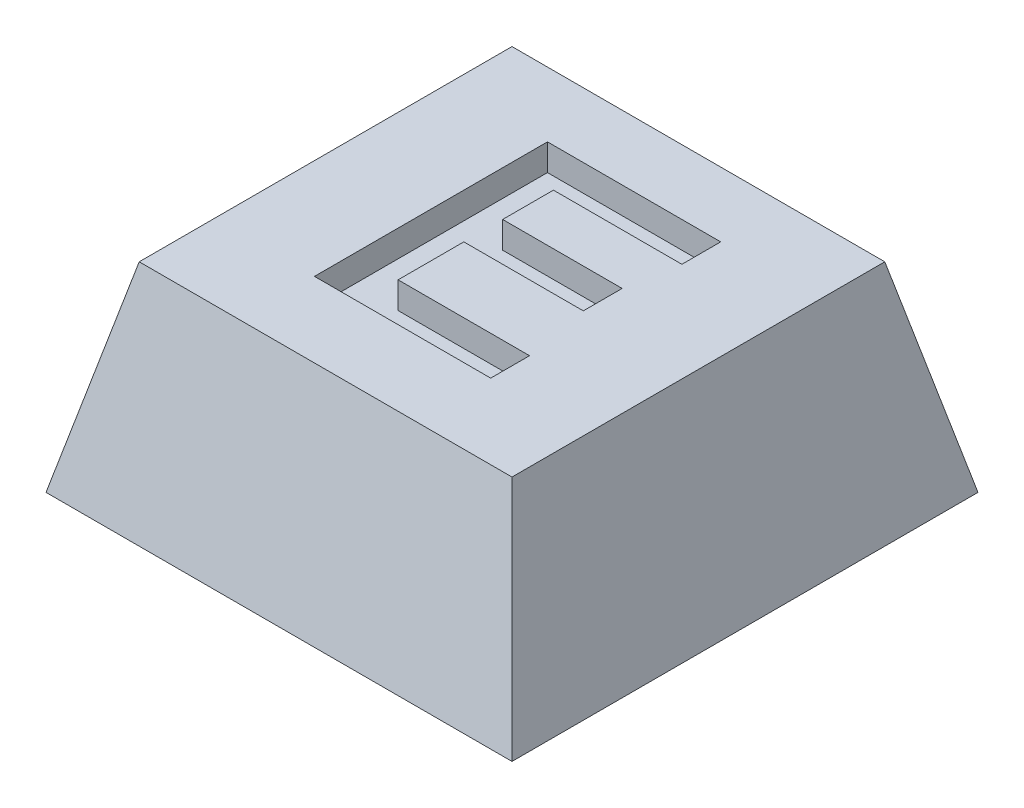
ISO-10303-21;
HEADER;
FILE_DESCRIPTION(('STEP AP214'),'2;1');
FILE_NAME('part.step','',(''),(''),'','','');
FILE_SCHEMA(('AUTOMOTIVE_DESIGN { 1 0 10303 214 1 1 1 1 }'));
ENDSEC;
DATA;
#1=APPLICATION_CONTEXT('core data for automotive mechanical design processes');
#2=APPLICATION_PROTOCOL_DEFINITION('international standard','automotive_design',2000,#1);
#3=PRODUCT_CONTEXT('',#1,'mechanical');
#4=PRODUCT('Part','Part','',(#3));
#5=PRODUCT_RELATED_PRODUCT_CATEGORY('part','',(#4));
#6=PRODUCT_DEFINITION_FORMATION('','',#4);
#7=PRODUCT_DEFINITION_CONTEXT('part definition',#1,'design');
#8=PRODUCT_DEFINITION('design','',#6,#7);
#9=PRODUCT_DEFINITION_SHAPE('','',#8);
#10=(LENGTH_UNIT() NAMED_UNIT(*) SI_UNIT(.MILLI.,.METRE.));
#11=(NAMED_UNIT(*) PLANE_ANGLE_UNIT() SI_UNIT($,.RADIAN.));
#12=(NAMED_UNIT(*) SI_UNIT($,.STERADIAN.) SOLID_ANGLE_UNIT());
#13=UNCERTAINTY_MEASURE_WITH_UNIT(LENGTH_MEASURE(1.E-05),#10,'distance_accuracy_value','');
#14=(GEOMETRIC_REPRESENTATION_CONTEXT(3) GLOBAL_UNCERTAINTY_ASSIGNED_CONTEXT((#13)) GLOBAL_UNIT_ASSIGNED_CONTEXT((#10,
#11,#12)) REPRESENTATION_CONTEXT('',''));
#15=CARTESIAN_POINT('',(0.,0.,0.));
#16=DIRECTION('',(0.,0.,1.));
#17=DIRECTION('',(1.,0.,0.));
#18=AXIS2_PLACEMENT_3D('',#15,#16,#17);
#19=CARTESIAN_POINT('',(0.,3.,0.));
#20=DIRECTION('',(0.,-1.,0.));
#21=DIRECTION('',(0.,0.,-1.));
#22=AXIS2_PLACEMENT_3D('',#19,#20,#21);
#23=PLANE('',#22);
#24=DIRECTION('',(-1.,0.,0.));
#25=VECTOR('',#24,1.);
#26=CARTESIAN_POINT('',(11.,3.,-0.7));
#27=LINE('',#26,#25);
#28=CARTESIAN_POINT('',(6.3,3.,-0.7));
#29=VERTEX_POINT('',#28);
#30=CARTESIAN_POINT('',(0.7,3.,-0.7));
#31=VERTEX_POINT('',#30);
#32=EDGE_CURVE('E66',#29,#31,#27,.T.);
#33=ORIENTED_EDGE('',*,*,#32,.F.);
#34=DIRECTION('',(0.,0.,1.));
#35=VECTOR('',#34,1.);
#36=CARTESIAN_POINT('',(6.3,3.,-7.));
#37=LINE('',#36,#35);
#38=CARTESIAN_POINT('',(6.3,3.,-6.3));
#39=VERTEX_POINT('',#38);
#40=EDGE_CURVE('E207',#39,#29,#37,.T.);
#41=ORIENTED_EDGE('',*,*,#40,.F.);
#42=DIRECTION('',(-1.,0.,0.));
#43=VECTOR('',#42,1.);
#44=CARTESIAN_POINT('',(11.,3.,-6.3));
#45=LINE('',#44,#43);
#46=CARTESIAN_POINT('',(0.699999999999998,3.,-6.3));
#47=VERTEX_POINT('',#46);
#48=EDGE_CURVE('E194',#39,#47,#45,.T.);
#49=ORIENTED_EDGE('',*,*,#48,.T.);
#50=DIRECTION('',(0.,0.,1.));
#51=VECTOR('',#50,1.);
#52=CARTESIAN_POINT('',(0.7,3.,-7.));
#53=LINE('',#52,#51);
#54=EDGE_CURVE('E208',#47,#31,#53,.T.);
#55=ORIENTED_EDGE('',*,*,#54,.T.);
#56=EDGE_LOOP('',(#33,#41,#49,#55));
#57=FACE_BOUND('',#56,.T.);
#58=DIRECTION('',(-1.,0.,0.));
#59=VECTOR('',#58,1.);
#60=CARTESIAN_POINT('',(4.85340318715444,3.,-1.82675202785535));
#61=LINE('',#60,#59);
#62=CARTESIAN_POINT('',(4.85340318715444,3.,-1.82675202785535));
#63=VERTEX_POINT('',#62);
#64=CARTESIAN_POINT('',(2.20596728971854,3.,-1.82675202785535));
#65=VERTEX_POINT('',#64);
#66=EDGE_CURVE('E59',#63,#65,#61,.T.);
#67=ORIENTED_EDGE('',*,*,#66,.T.);
#68=DIRECTION('',(0.,0.,-1.));
#69=VECTOR('',#68,1.);
#70=CARTESIAN_POINT('',(2.20596728971854,3.,-1.82675202785535));
#71=LINE('',#70,#69);
#72=CARTESIAN_POINT('',(2.20596728971854,3.,-5.32675202785535));
#73=VERTEX_POINT('',#72);
#74=EDGE_CURVE('E178',#65,#73,#71,.T.);
#75=ORIENTED_EDGE('',*,*,#74,.T.);
#76=DIRECTION('',(1.,0.,0.));
#77=VECTOR('',#76,1.);
#78=CARTESIAN_POINT('',(2.20596728971854,3.,-5.32675202785535));
#79=LINE('',#78,#77);
#80=CARTESIAN_POINT('',(4.80853139228265,3.,-5.32675202785535));
#81=VERTEX_POINT('',#80);
#82=EDGE_CURVE('E533',#73,#81,#79,.T.);
#83=ORIENTED_EDGE('',*,*,#82,.T.);
#84=DIRECTION('',(0.,0.,1.));
#85=VECTOR('',#84,1.);
#86=CARTESIAN_POINT('',(4.80853139228265,3.,-5.32675202785535));
#87=LINE('',#86,#85);
#88=CARTESIAN_POINT('',(4.80853139228265,3.,-4.74341869452202));
#89=VERTEX_POINT('',#88);
#90=EDGE_CURVE('E535',#81,#89,#87,.T.);
#91=ORIENTED_EDGE('',*,*,#90,.T.);
#92=DIRECTION('',(-1.,0.,0.));
#93=VECTOR('',#92,1.);
#94=CARTESIAN_POINT('',(4.80853139228265,3.,-4.74341869452202));
#95=LINE('',#94,#93);
#96=CARTESIAN_POINT('',(2.87904421279547,3.,-4.74341869452202));
#97=VERTEX_POINT('',#96);
#98=EDGE_CURVE('E540',#89,#97,#95,.T.);
#99=ORIENTED_EDGE('',*,*,#98,.T.);
#100=DIRECTION('',(0.,0.,1.));
#101=VECTOR('',#100,1.);
#102=CARTESIAN_POINT('',(2.87904421279547,3.,-4.74341869452202));
#103=LINE('',#102,#101);
#104=CARTESIAN_POINT('',(2.87904421279547,3.,-3.9805981817015));
#105=VERTEX_POINT('',#104);
#106=EDGE_CURVE('E550',#97,#105,#103,.T.);
#107=ORIENTED_EDGE('',*,*,#106,.T.);
#108=DIRECTION('',(1.,0.,0.));
#109=VECTOR('',#108,1.);
#110=CARTESIAN_POINT('',(2.87904421279547,3.,-3.9805981817015));
#111=LINE('',#110,#109);
#112=CARTESIAN_POINT('',(4.67391600766726,3.,-3.9805981817015));
#113=VERTEX_POINT('',#112);
#114=EDGE_CURVE('E554',#105,#113,#111,.T.);
#115=ORIENTED_EDGE('',*,*,#114,.T.);
#116=DIRECTION('',(0.,0.,1.));
#117=VECTOR('',#116,1.);
#118=CARTESIAN_POINT('',(4.67391600766726,3.,-3.9805981817015));
#119=LINE('',#118,#117);
#120=CARTESIAN_POINT('',(4.67391600766726,3.,-3.39726484836817));
#121=VERTEX_POINT('',#120);
#122=EDGE_CURVE('E558',#113,#121,#119,.T.);
#123=ORIENTED_EDGE('',*,*,#122,.T.);
#124=DIRECTION('',(-1.,0.,0.));
#125=VECTOR('',#124,1.);
#126=CARTESIAN_POINT('',(4.67391600766726,3.,-3.39726484836817));
#127=LINE('',#126,#125);
#128=CARTESIAN_POINT('',(2.87904421279547,3.,-3.39726484836817));
#129=VERTEX_POINT('',#128);
#130=EDGE_CURVE('E499',#121,#129,#127,.T.);
#131=ORIENTED_EDGE('',*,*,#130,.T.);
#132=DIRECTION('',(0.,0.,1.));
#133=VECTOR('',#132,1.);
#134=CARTESIAN_POINT('',(2.87904421279547,3.,-3.39726484836817));
#135=LINE('',#134,#133);
#136=CARTESIAN_POINT('',(2.87904421279547,3.,-2.41008536118868));
#137=VERTEX_POINT('',#136);
#138=EDGE_CURVE('E494',#129,#137,#135,.T.);
#139=ORIENTED_EDGE('',*,*,#138,.T.);
#140=DIRECTION('',(1.,0.,0.));
#141=VECTOR('',#140,1.);
#142=CARTESIAN_POINT('',(2.87904421279547,3.,-2.41008536118868));
#143=LINE('',#142,#141);
#144=CARTESIAN_POINT('',(4.85340318715444,3.,-2.41008536118868));
#145=VERTEX_POINT('',#144);
#146=EDGE_CURVE('E488',#137,#145,#143,.T.);
#147=ORIENTED_EDGE('',*,*,#146,.T.);
#148=DIRECTION('',(0.,0.,1.));
#149=VECTOR('',#148,1.);
#150=CARTESIAN_POINT('',(4.85340318715444,3.,-2.41008536118868));
#151=LINE('',#150,#149);
#152=EDGE_CURVE('E174',#145,#63,#151,.T.);
#153=ORIENTED_EDGE('',*,*,#152,.T.);
#154=EDGE_LOOP('',(#67,#75,#83,#91,#99,#107,#115,#123,#131,#139,#147,#153));
#155=FACE_BOUND('',#154,.T.);
#156=ADVANCED_FACE('F43',(#57,#155),#23,.F.);
#157=CARTESIAN_POINT('',(7.,0.,-7.));
#158=DIRECTION('',(-0.973841209741793,-0.227229615606418,0.));
#159=DIRECTION('',(0.227229615606418,-0.973841209741793,0.));
#160=AXIS2_PLACEMENT_3D('',#157,#158,#159);
#161=PLANE('',#160);
#162=DIRECTION('',(-0.221581128241521,0.949633406749377,-0.221581128241521));
#163=VECTOR('',#162,1.);
#164=CARTESIAN_POINT('',(6.6563126252505,1.47294589178357,-0.343687374749499));
#165=LINE('',#164,#163);
#166=CARTESIAN_POINT('',(7.,0.,0.));
#167=VERTEX_POINT('',#166);
#168=EDGE_CURVE('E204',#167,#29,#165,.T.);
#169=ORIENTED_EDGE('',*,*,#168,.F.);
#170=DIRECTION('',(0.,0.,-1.));
#171=VECTOR('',#170,1.);
#172=CARTESIAN_POINT('',(7.,0.,0.));
#173=LINE('',#172,#171);
#174=CARTESIAN_POINT('',(7.,0.,-7.));
#175=VERTEX_POINT('',#174);
#176=EDGE_CURVE('E222',#167,#175,#173,.T.);
#177=ORIENTED_EDGE('',*,*,#176,.T.);
#178=DIRECTION('',(0.221581128241521,-0.949633406749377,-0.221581128241521));
#179=VECTOR('',#178,1.);
#180=CARTESIAN_POINT('',(7.,0.,-7.));
#181=LINE('',#180,#179);
#182=EDGE_CURVE('E198',#39,#175,#181,.T.);
#183=ORIENTED_EDGE('',*,*,#182,.F.);
#184=ORIENTED_EDGE('',*,*,#40,.T.);
#185=EDGE_LOOP('',(#169,#177,#183,#184));
#186=FACE_BOUND('',#185,.T.);
#187=ADVANCED_FACE('F247',(#186),#161,.F.);
#188=CARTESIAN_POINT('',(0.,0.,-7.));
#189=DIRECTION('',(0.973841209741793,-0.227229615606418,0.));
#190=DIRECTION('',(0.227229615606418,0.973841209741793,0.));
#191=AXIS2_PLACEMENT_3D('',#188,#189,#190);
#192=PLANE('',#191);
#193=DIRECTION('',(-0.221581128241521,-0.949633406749378,0.221581128241521));
#194=VECTOR('',#193,1.);
#195=CARTESIAN_POINT('',(0.343687374749499,1.47294589178357,-0.3436873747495));
#196=LINE('',#195,#194);
#197=CARTESIAN_POINT('',(0.,0.,0.));
#198=VERTEX_POINT('',#197);
#199=EDGE_CURVE('E11',#31,#198,#196,.T.);
#200=ORIENTED_EDGE('',*,*,#199,.F.);
#201=ORIENTED_EDGE('',*,*,#54,.F.);
#202=DIRECTION('',(0.221581128241521,0.949633406749377,0.221581128241521));
#203=VECTOR('',#202,1.);
#204=CARTESIAN_POINT('',(0.,0.,-7.));
#205=LINE('',#204,#203);
#206=CARTESIAN_POINT('',(0.,0.,-7.));
#207=VERTEX_POINT('',#206);
#208=EDGE_CURVE('E52',#207,#47,#205,.T.);
#209=ORIENTED_EDGE('',*,*,#208,.F.);
#210=DIRECTION('',(0.,0.,1.));
#211=VECTOR('',#210,1.);
#212=CARTESIAN_POINT('',(0.,0.,0.));
#213=LINE('',#212,#211);
#214=EDGE_CURVE('E212',#207,#198,#213,.T.);
#215=ORIENTED_EDGE('',*,*,#214,.T.);
#216=EDGE_LOOP('',(#200,#201,#209,#215));
#217=FACE_BOUND('',#216,.T.);
#218=ADVANCED_FACE('F240',(#217),#192,.F.);
#219=CARTESIAN_POINT('',(0.,0.,0.));
#220=DIRECTION('',(0.,-1.,0.));
#221=DIRECTION('',(0.,0.,-1.));
#222=AXIS2_PLACEMENT_3D('',#219,#220,#221);
#223=PLANE('',#222);
#224=CARTESIAN_POINT('',(3.5,0.,-3.5));
#225=DIRECTION('',(0.,-1.,0.));
#226=DIRECTION('',(0.,0.,-1.));
#227=AXIS2_PLACEMENT_3D('',#224,#225,#226);
#228=CIRCLE('',#227,1.8);
#229=CARTESIAN_POINT('',(3.5,0.,-5.3));
#230=VERTEX_POINT('',#229);
#231=EDGE_CURVE('E180',#230,#230,#228,.T.);
#232=ORIENTED_EDGE('',*,*,#231,.F.);
#233=EDGE_LOOP('',(#232));
#234=FACE_BOUND('',#233,.T.);
#235=ORIENTED_EDGE('',*,*,#214,.F.);
#236=DIRECTION('',(-1.,0.,0.));
#237=VECTOR('',#236,1.);
#238=CARTESIAN_POINT('',(0.,0.,-7.));
#239=LINE('',#238,#237);
#240=EDGE_CURVE('E226',#175,#207,#239,.T.);
#241=ORIENTED_EDGE('',*,*,#240,.F.);
#242=ORIENTED_EDGE('',*,*,#176,.F.);
#243=DIRECTION('',(1.,0.,0.));
#244=VECTOR('',#243,1.);
#245=CARTESIAN_POINT('',(0.,0.,0.));
#246=LINE('',#245,#244);
#247=EDGE_CURVE('E219',#198,#167,#246,.T.);
#248=ORIENTED_EDGE('',*,*,#247,.F.);
#249=EDGE_LOOP('',(#235,#241,#242,#248));
#250=FACE_BOUND('',#249,.T.);
#251=ADVANCED_FACE('F45',(#234,#250),#223,.T.);
#252=CARTESIAN_POINT('',(11.,3.,-6.3));
#253=DIRECTION('',(0.,0.227229615606418,-0.973841209741793));
#254=DIRECTION('',(0.,0.973841209741793,0.227229615606418));
#255=AXIS2_PLACEMENT_3D('',#252,#253,#254);
#256=PLANE('',#255);
#257=ORIENTED_EDGE('',*,*,#182,.T.);
#258=ORIENTED_EDGE('',*,*,#240,.T.);
#259=ORIENTED_EDGE('',*,*,#208,.T.);
#260=ORIENTED_EDGE('',*,*,#48,.F.);
#261=EDGE_LOOP('',(#257,#258,#259,#260));
#262=FACE_BOUND('',#261,.T.);
#263=ADVANCED_FACE('F231',(#262),#256,.T.);
#264=CARTESIAN_POINT('',(11.,0.,0.));
#265=DIRECTION('',(0.,0.227229615606418,0.973841209741793));
#266=DIRECTION('',(0.,-0.973841209741793,0.227229615606418));
#267=AXIS2_PLACEMENT_3D('',#264,#265,#266);
#268=PLANE('',#267);
#269=ORIENTED_EDGE('',*,*,#168,.T.);
#270=ORIENTED_EDGE('',*,*,#32,.T.);
#271=ORIENTED_EDGE('',*,*,#199,.T.);
#272=ORIENTED_EDGE('',*,*,#247,.T.);
#273=EDGE_LOOP('',(#269,#270,#271,#272));
#274=FACE_BOUND('',#273,.T.);
#275=ADVANCED_FACE('F242',(#274),#268,.T.);
#276=CARTESIAN_POINT('',(3.5,0.8,-3.5));
#277=DIRECTION('',(0.,-1.,0.));
#278=DIRECTION('',(0.,0.,-1.));
#279=AXIS2_PLACEMENT_3D('',#276,#277,#278);
#280=CYLINDRICAL_SURFACE('',#279,1.8);
#281=CARTESIAN_POINT('',(3.5,0.8,-3.5));
#282=DIRECTION('',(0.,-1.,0.));
#283=DIRECTION('',(0.,0.,-1.));
#284=AXIS2_PLACEMENT_3D('',#281,#282,#283);
#285=CIRCLE('',#284,1.8);
#286=CARTESIAN_POINT('',(3.5,0.8,-5.3));
#287=VERTEX_POINT('',#286);
#288=EDGE_CURVE('E186',#287,#287,#285,.T.);
#289=ORIENTED_EDGE('',*,*,#288,.F.);
#290=EDGE_LOOP('',(#289));
#291=FACE_BOUND('',#290,.T.);
#292=ORIENTED_EDGE('',*,*,#231,.T.);
#293=EDGE_LOOP('',(#292));
#294=FACE_BOUND('',#293,.T.);
#295=ADVANCED_FACE('F265',(#291,#294),#280,.F.);
#296=CARTESIAN_POINT('',(3.5,0.8,-3.5));
#297=DIRECTION('',(0.,-1.,0.));
#298=DIRECTION('',(0.,0.,-1.));
#299=AXIS2_PLACEMENT_3D('',#296,#297,#298);
#300=PLANE('',#299);
#301=ORIENTED_EDGE('',*,*,#288,.T.);
#302=EDGE_LOOP('',(#301));
#303=FACE_BOUND('',#302,.T.);
#304=ADVANCED_FACE('F268',(#303),#300,.T.);
#305=CARTESIAN_POINT('',(4.85340318715444,2.6,-1.82675202785535));
#306=DIRECTION('',(0.,0.,-1.));
#307=DIRECTION('',(-1.,0.,0.));
#308=AXIS2_PLACEMENT_3D('',#305,#306,#307);
#309=PLANE('',#308);
#310=ORIENTED_EDGE('',*,*,#66,.F.);
#311=DIRECTION('',(0.,1.,0.));
#312=VECTOR('',#311,1.);
#313=CARTESIAN_POINT('',(4.85340318715444,2.6,-1.82675202785535));
#314=LINE('',#313,#312);
#315=CARTESIAN_POINT('',(4.85340318715444,2.6,-1.82675202785535));
#316=VERTEX_POINT('',#315);
#317=EDGE_CURVE('E172',#316,#63,#314,.T.);
#318=ORIENTED_EDGE('',*,*,#317,.F.);
#319=DIRECTION('',(-1.,0.,0.));
#320=VECTOR('',#319,1.);
#321=CARTESIAN_POINT('',(4.85340318715444,2.6,-1.82675202785535));
#322=LINE('',#321,#320);
#323=CARTESIAN_POINT('',(2.20596728971854,2.6,-1.82675202785535));
#324=VERTEX_POINT('',#323);
#325=EDGE_CURVE('E162',#316,#324,#322,.T.);
#326=ORIENTED_EDGE('',*,*,#325,.T.);
#327=DIRECTION('',(0.,1.,0.));
#328=VECTOR('',#327,1.);
#329=CARTESIAN_POINT('',(2.20596728971854,2.6,-1.82675202785535));
#330=LINE('',#329,#328);
#331=EDGE_CURVE('E171',#324,#65,#330,.T.);
#332=ORIENTED_EDGE('',*,*,#331,.T.);
#333=EDGE_LOOP('',(#310,#318,#326,#332));
#334=FACE_BOUND('',#333,.T.);
#335=ADVANCED_FACE('F170',(#334),#309,.T.);
#336=CARTESIAN_POINT('',(2.20596728971854,2.6,-1.82675202785535));
#337=DIRECTION('',(1.,0.,0.));
#338=DIRECTION('',(0.,0.,-1.));
#339=AXIS2_PLACEMENT_3D('',#336,#337,#338);
#340=PLANE('',#339);
#341=ORIENTED_EDGE('',*,*,#74,.F.);
#342=ORIENTED_EDGE('',*,*,#331,.F.);
#343=DIRECTION('',(0.,0.,-1.));
#344=VECTOR('',#343,1.);
#345=CARTESIAN_POINT('',(2.20596728971854,2.6,-1.82675202785535));
#346=LINE('',#345,#344);
#347=CARTESIAN_POINT('',(2.20596728971854,2.6,-5.32675202785535));
#348=VERTEX_POINT('',#347);
#349=EDGE_CURVE('E158',#324,#348,#346,.T.);
#350=ORIENTED_EDGE('',*,*,#349,.T.);
#351=DIRECTION('',(0.,1.,0.));
#352=VECTOR('',#351,1.);
#353=CARTESIAN_POINT('',(2.20596728971854,2.6,-5.32675202785535));
#354=LINE('',#353,#352);
#355=EDGE_CURVE('E181',#348,#73,#354,.T.);
#356=ORIENTED_EDGE('',*,*,#355,.T.);
#357=EDGE_LOOP('',(#341,#342,#350,#356));
#358=FACE_BOUND('',#357,.T.);
#359=ADVANCED_FACE('F176',(#358),#340,.T.);
#360=CARTESIAN_POINT('',(2.20596728971854,2.6,-5.32675202785535));
#361=DIRECTION('',(0.,0.,1.));
#362=DIRECTION('',(1.,0.,0.));
#363=AXIS2_PLACEMENT_3D('',#360,#361,#362);
#364=PLANE('',#363);
#365=ORIENTED_EDGE('',*,*,#82,.F.);
#366=ORIENTED_EDGE('',*,*,#355,.F.);
#367=DIRECTION('',(1.,0.,0.));
#368=VECTOR('',#367,1.);
#369=CARTESIAN_POINT('',(2.20596728971854,2.6,-5.32675202785535));
#370=LINE('',#369,#368);
#371=CARTESIAN_POINT('',(4.80853139228265,2.6,-5.32675202785535));
#372=VERTEX_POINT('',#371);
#373=EDGE_CURVE('E164',#348,#372,#370,.T.);
#374=ORIENTED_EDGE('',*,*,#373,.T.);
#375=DIRECTION('',(0.,1.,0.));
#376=VECTOR('',#375,1.);
#377=CARTESIAN_POINT('',(4.80853139228265,2.6,-5.32675202785535));
#378=LINE('',#377,#376);
#379=EDGE_CURVE('E188',#372,#81,#378,.T.);
#380=ORIENTED_EDGE('',*,*,#379,.T.);
#381=EDGE_LOOP('',(#365,#366,#374,#380));
#382=FACE_BOUND('',#381,.T.);
#383=ADVANCED_FACE('F277',(#382),#364,.T.);
#384=CARTESIAN_POINT('',(4.80853139228265,2.6,-5.32675202785535));
#385=DIRECTION('',(-1.,0.,0.));
#386=DIRECTION('',(0.,0.,1.));
#387=AXIS2_PLACEMENT_3D('',#384,#385,#386);
#388=PLANE('',#387);
#389=ORIENTED_EDGE('',*,*,#90,.F.);
#390=ORIENTED_EDGE('',*,*,#379,.F.);
#391=DIRECTION('',(0.,0.,1.));
#392=VECTOR('',#391,1.);
#393=CARTESIAN_POINT('',(4.80853139228265,2.6,-5.32675202785535));
#394=LINE('',#393,#392);
#395=CARTESIAN_POINT('',(4.80853139228265,2.6,-4.74341869452202));
#396=VERTEX_POINT('',#395);
#397=EDGE_CURVE('E594',#372,#396,#394,.T.);
#398=ORIENTED_EDGE('',*,*,#397,.T.);
#399=DIRECTION('',(0.,1.,0.));
#400=VECTOR('',#399,1.);
#401=CARTESIAN_POINT('',(4.80853139228265,2.6,-4.74341869452202));
#402=LINE('',#401,#400);
#403=EDGE_CURVE('E526',#396,#89,#402,.T.);
#404=ORIENTED_EDGE('',*,*,#403,.T.);
#405=EDGE_LOOP('',(#389,#390,#398,#404));
#406=FACE_BOUND('',#405,.T.);
#407=ADVANCED_FACE('F280',(#406),#388,.T.);
#408=CARTESIAN_POINT('',(4.80853139228265,2.6,-4.74341869452202));
#409=DIRECTION('',(0.,0.,-1.));
#410=DIRECTION('',(-1.,0.,0.));
#411=AXIS2_PLACEMENT_3D('',#408,#409,#410);
#412=PLANE('',#411);
#413=ORIENTED_EDGE('',*,*,#98,.F.);
#414=ORIENTED_EDGE('',*,*,#403,.F.);
#415=DIRECTION('',(-1.,0.,0.));
#416=VECTOR('',#415,1.);
#417=CARTESIAN_POINT('',(4.80853139228265,2.6,-4.74341869452202));
#418=LINE('',#417,#416);
#419=CARTESIAN_POINT('',(2.87904421279547,2.6,-4.74341869452202));
#420=VERTEX_POINT('',#419);
#421=EDGE_CURVE('E591',#396,#420,#418,.T.);
#422=ORIENTED_EDGE('',*,*,#421,.T.);
#423=DIRECTION('',(0.,1.,0.));
#424=VECTOR('',#423,1.);
#425=CARTESIAN_POINT('',(2.87904421279547,2.6,-4.74341869452202));
#426=LINE('',#425,#424);
#427=EDGE_CURVE('E523',#420,#97,#426,.T.);
#428=ORIENTED_EDGE('',*,*,#427,.T.);
#429=EDGE_LOOP('',(#413,#414,#422,#428));
#430=FACE_BOUND('',#429,.T.);
#431=ADVANCED_FACE('F284',(#430),#412,.T.);
#432=CARTESIAN_POINT('',(2.87904421279547,2.6,-4.74341869452202));
#433=DIRECTION('',(-1.,0.,0.));
#434=DIRECTION('',(0.,0.,1.));
#435=AXIS2_PLACEMENT_3D('',#432,#433,#434);
#436=PLANE('',#435);
#437=ORIENTED_EDGE('',*,*,#106,.F.);
#438=ORIENTED_EDGE('',*,*,#427,.F.);
#439=DIRECTION('',(0.,0.,1.));
#440=VECTOR('',#439,1.);
#441=CARTESIAN_POINT('',(2.87904421279547,2.6,-4.74341869452202));
#442=LINE('',#441,#440);
#443=CARTESIAN_POINT('',(2.87904421279547,2.6,-3.9805981817015));
#444=VERTEX_POINT('',#443);
#445=EDGE_CURVE('E588',#420,#444,#442,.T.);
#446=ORIENTED_EDGE('',*,*,#445,.T.);
#447=DIRECTION('',(0.,1.,0.));
#448=VECTOR('',#447,1.);
#449=CARTESIAN_POINT('',(2.87904421279547,2.6,-3.9805981817015));
#450=LINE('',#449,#448);
#451=EDGE_CURVE('E520',#444,#105,#450,.T.);
#452=ORIENTED_EDGE('',*,*,#451,.T.);
#453=EDGE_LOOP('',(#437,#438,#446,#452));
#454=FACE_BOUND('',#453,.T.);
#455=ADVANCED_FACE('F288',(#454),#436,.T.);
#456=CARTESIAN_POINT('',(2.87904421279547,2.6,-3.9805981817015));
#457=DIRECTION('',(0.,0.,1.));
#458=DIRECTION('',(1.,0.,0.));
#459=AXIS2_PLACEMENT_3D('',#456,#457,#458);
#460=PLANE('',#459);
#461=ORIENTED_EDGE('',*,*,#114,.F.);
#462=ORIENTED_EDGE('',*,*,#451,.F.);
#463=DIRECTION('',(1.,0.,0.));
#464=VECTOR('',#463,1.);
#465=CARTESIAN_POINT('',(2.87904421279547,2.6,-3.9805981817015));
#466=LINE('',#465,#464);
#467=CARTESIAN_POINT('',(4.67391600766726,2.6,-3.9805981817015));
#468=VERTEX_POINT('',#467);
#469=EDGE_CURVE('E585',#444,#468,#466,.T.);
#470=ORIENTED_EDGE('',*,*,#469,.T.);
#471=DIRECTION('',(0.,1.,0.));
#472=VECTOR('',#471,1.);
#473=CARTESIAN_POINT('',(4.67391600766726,2.6,-3.9805981817015));
#474=LINE('',#473,#472);
#475=EDGE_CURVE('E517',#468,#113,#474,.T.);
#476=ORIENTED_EDGE('',*,*,#475,.T.);
#477=EDGE_LOOP('',(#461,#462,#470,#476));
#478=FACE_BOUND('',#477,.T.);
#479=ADVANCED_FACE('F292',(#478),#460,.T.);
#480=CARTESIAN_POINT('',(4.67391600766726,2.6,-3.9805981817015));
#481=DIRECTION('',(-1.,0.,0.));
#482=DIRECTION('',(0.,0.,1.));
#483=AXIS2_PLACEMENT_3D('',#480,#481,#482);
#484=PLANE('',#483);
#485=ORIENTED_EDGE('',*,*,#122,.F.);
#486=ORIENTED_EDGE('',*,*,#475,.F.);
#487=DIRECTION('',(0.,0.,1.));
#488=VECTOR('',#487,1.);
#489=CARTESIAN_POINT('',(4.67391600766726,2.6,-3.9805981817015));
#490=LINE('',#489,#488);
#491=CARTESIAN_POINT('',(4.67391600766726,2.6,-3.39726484836817));
#492=VERTEX_POINT('',#491);
#493=EDGE_CURVE('E582',#468,#492,#490,.T.);
#494=ORIENTED_EDGE('',*,*,#493,.T.);
#495=DIRECTION('',(0.,1.,0.));
#496=VECTOR('',#495,1.);
#497=CARTESIAN_POINT('',(4.67391600766726,2.6,-3.39726484836817));
#498=LINE('',#497,#496);
#499=EDGE_CURVE('E514',#492,#121,#498,.T.);
#500=ORIENTED_EDGE('',*,*,#499,.T.);
#501=EDGE_LOOP('',(#485,#486,#494,#500));
#502=FACE_BOUND('',#501,.T.);
#503=ADVANCED_FACE('F296',(#502),#484,.T.);
#504=CARTESIAN_POINT('',(4.67391600766726,2.6,-3.39726484836817));
#505=DIRECTION('',(0.,0.,-1.));
#506=DIRECTION('',(-1.,0.,0.));
#507=AXIS2_PLACEMENT_3D('',#504,#505,#506);
#508=PLANE('',#507);
#509=ORIENTED_EDGE('',*,*,#130,.F.);
#510=ORIENTED_EDGE('',*,*,#499,.F.);
#511=DIRECTION('',(-1.,0.,0.));
#512=VECTOR('',#511,1.);
#513=CARTESIAN_POINT('',(4.67391600766726,2.6,-3.39726484836817));
#514=LINE('',#513,#512);
#515=CARTESIAN_POINT('',(2.87904421279547,2.6,-3.39726484836817));
#516=VERTEX_POINT('',#515);
#517=EDGE_CURVE('E567',#492,#516,#514,.T.);
#518=ORIENTED_EDGE('',*,*,#517,.T.);
#519=DIRECTION('',(0.,1.,0.));
#520=VECTOR('',#519,1.);
#521=CARTESIAN_POINT('',(2.87904421279547,2.6,-3.39726484836817));
#522=LINE('',#521,#520);
#523=EDGE_CURVE('E511',#516,#129,#522,.T.);
#524=ORIENTED_EDGE('',*,*,#523,.T.);
#525=EDGE_LOOP('',(#509,#510,#518,#524));
#526=FACE_BOUND('',#525,.T.);
#527=ADVANCED_FACE('F300',(#526),#508,.T.);
#528=CARTESIAN_POINT('',(2.87904421279547,2.6,-3.39726484836817));
#529=DIRECTION('',(-1.,0.,0.));
#530=DIRECTION('',(0.,0.,1.));
#531=AXIS2_PLACEMENT_3D('',#528,#529,#530);
#532=PLANE('',#531);
#533=ORIENTED_EDGE('',*,*,#138,.F.);
#534=ORIENTED_EDGE('',*,*,#523,.F.);
#535=DIRECTION('',(0.,0.,1.));
#536=VECTOR('',#535,1.);
#537=CARTESIAN_POINT('',(2.87904421279547,2.6,-3.39726484836817));
#538=LINE('',#537,#536);
#539=CARTESIAN_POINT('',(2.87904421279547,2.6,-2.41008536118868));
#540=VERTEX_POINT('',#539);
#541=EDGE_CURVE('E569',#516,#540,#538,.T.);
#542=ORIENTED_EDGE('',*,*,#541,.T.);
#543=DIRECTION('',(0.,1.,0.));
#544=VECTOR('',#543,1.);
#545=CARTESIAN_POINT('',(2.87904421279547,2.6,-2.41008536118868));
#546=LINE('',#545,#544);
#547=EDGE_CURVE('E508',#540,#137,#546,.T.);
#548=ORIENTED_EDGE('',*,*,#547,.T.);
#549=EDGE_LOOP('',(#533,#534,#542,#548));
#550=FACE_BOUND('',#549,.T.);
#551=ADVANCED_FACE('F304',(#550),#532,.T.);
#552=CARTESIAN_POINT('',(2.87904421279547,2.6,-2.41008536118868));
#553=DIRECTION('',(0.,0.,1.));
#554=DIRECTION('',(1.,0.,0.));
#555=AXIS2_PLACEMENT_3D('',#552,#553,#554);
#556=PLANE('',#555);
#557=ORIENTED_EDGE('',*,*,#146,.F.);
#558=ORIENTED_EDGE('',*,*,#547,.F.);
#559=DIRECTION('',(1.,0.,0.));
#560=VECTOR('',#559,1.);
#561=CARTESIAN_POINT('',(2.87904421279547,2.6,-2.41008536118868));
#562=LINE('',#561,#560);
#563=CARTESIAN_POINT('',(4.85340318715444,2.6,-2.41008536118868));
#564=VERTEX_POINT('',#563);
#565=EDGE_CURVE('E571',#540,#564,#562,.T.);
#566=ORIENTED_EDGE('',*,*,#565,.T.);
#567=DIRECTION('',(0.,1.,0.));
#568=VECTOR('',#567,1.);
#569=CARTESIAN_POINT('',(4.85340318715444,2.6,-2.41008536118868));
#570=LINE('',#569,#568);
#571=EDGE_CURVE('E486',#564,#145,#570,.T.);
#572=ORIENTED_EDGE('',*,*,#571,.T.);
#573=EDGE_LOOP('',(#557,#558,#566,#572));
#574=FACE_BOUND('',#573,.T.);
#575=ADVANCED_FACE('F308',(#574),#556,.T.);
#576=CARTESIAN_POINT('',(4.85340318715444,2.6,-2.41008536118868));
#577=DIRECTION('',(-1.,0.,0.));
#578=DIRECTION('',(0.,0.,1.));
#579=AXIS2_PLACEMENT_3D('',#576,#577,#578);
#580=PLANE('',#579);
#581=ORIENTED_EDGE('',*,*,#152,.F.);
#582=ORIENTED_EDGE('',*,*,#571,.F.);
#583=DIRECTION('',(0.,0.,1.));
#584=VECTOR('',#583,1.);
#585=CARTESIAN_POINT('',(4.85340318715444,2.6,-2.41008536118868));
#586=LINE('',#585,#584);
#587=EDGE_CURVE('E505',#564,#316,#586,.T.);
#588=ORIENTED_EDGE('',*,*,#587,.T.);
#589=ORIENTED_EDGE('',*,*,#317,.T.);
#590=EDGE_LOOP('',(#581,#582,#588,#589));
#591=FACE_BOUND('',#590,.T.);
#592=ADVANCED_FACE('F312',(#591),#580,.T.);
#593=CARTESIAN_POINT('',(0.,2.6,0.));
#594=DIRECTION('',(0.,-1.,0.));
#595=DIRECTION('',(0.,0.,-1.));
#596=AXIS2_PLACEMENT_3D('',#593,#594,#595);
#597=PLANE('',#596);
#598=ORIENTED_EDGE('',*,*,#325,.F.);
#599=ORIENTED_EDGE('',*,*,#587,.F.);
#600=ORIENTED_EDGE('',*,*,#565,.F.);
#601=ORIENTED_EDGE('',*,*,#541,.F.);
#602=ORIENTED_EDGE('',*,*,#517,.F.);
#603=ORIENTED_EDGE('',*,*,#493,.F.);
#604=ORIENTED_EDGE('',*,*,#469,.F.);
#605=ORIENTED_EDGE('',*,*,#445,.F.);
#606=ORIENTED_EDGE('',*,*,#421,.F.);
#607=ORIENTED_EDGE('',*,*,#397,.F.);
#608=ORIENTED_EDGE('',*,*,#373,.F.);
#609=ORIENTED_EDGE('',*,*,#349,.F.);
#610=EDGE_LOOP('',(#598,#599,#600,#601,#602,#603,#604,#605,#606,#607,#608,#609));
#611=FACE_BOUND('',#610,.T.);
#612=ADVANCED_FACE('F160',(#611),#597,.F.);
#613=CLOSED_SHELL('',(#156,#187,#218,#251,#263,#275,#295,#304,#335,#359,#383,#407,#431,#455,
#479,#503,#527,#551,#575,#592,#612));
#614=MANIFOLD_SOLID_BREP('B2',#613);
#615=ADVANCED_BREP_SHAPE_REPRESENTATION('',(#18,#614),#14);
#616=SHAPE_DEFINITION_REPRESENTATION(#9,#615);
ENDSEC;
END-ISO-10303-21;
